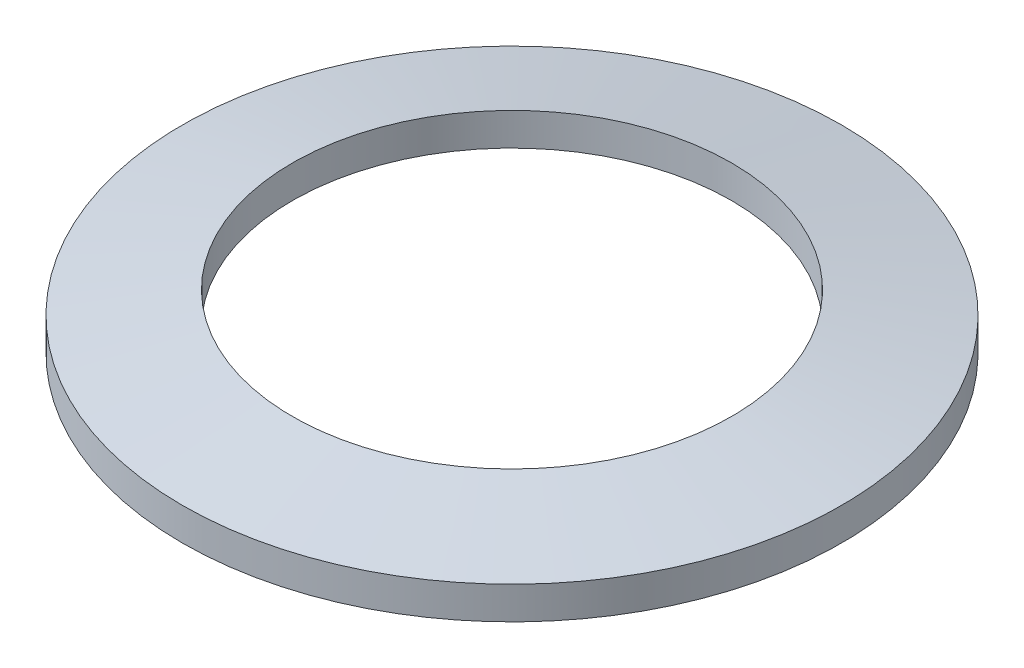
ISO-10303-21;
HEADER;
FILE_DESCRIPTION(('STEP AP214'),'2;1');
FILE_NAME('part.step','',(''),(''),'','','');
FILE_SCHEMA(('AUTOMOTIVE_DESIGN { 1 0 10303 214 1 1 1 1 }'));
ENDSEC;
DATA;
#1=APPLICATION_CONTEXT('core data for automotive mechanical design processes');
#2=APPLICATION_PROTOCOL_DEFINITION('international standard','automotive_design',2000,#1);
#3=PRODUCT_CONTEXT('',#1,'mechanical');
#4=PRODUCT('Part','Part','',(#3));
#5=PRODUCT_RELATED_PRODUCT_CATEGORY('part','',(#4));
#6=PRODUCT_DEFINITION_FORMATION('','',#4);
#7=PRODUCT_DEFINITION_CONTEXT('part definition',#1,'design');
#8=PRODUCT_DEFINITION('design','',#6,#7);
#9=PRODUCT_DEFINITION_SHAPE('','',#8);
#10=(LENGTH_UNIT() NAMED_UNIT(*) SI_UNIT(.MILLI.,.METRE.));
#11=(NAMED_UNIT(*) PLANE_ANGLE_UNIT() SI_UNIT($,.RADIAN.));
#12=(NAMED_UNIT(*) SI_UNIT($,.STERADIAN.) SOLID_ANGLE_UNIT());
#13=UNCERTAINTY_MEASURE_WITH_UNIT(LENGTH_MEASURE(1.E-05),#10,'distance_accuracy_value','');
#14=(GEOMETRIC_REPRESENTATION_CONTEXT(3) GLOBAL_UNCERTAINTY_ASSIGNED_CONTEXT((#13)) GLOBAL_UNIT_ASSIGNED_CONTEXT((#10,
#11,#12)) REPRESENTATION_CONTEXT('',''));
#15=CARTESIAN_POINT('',(0.,0.,0.));
#16=DIRECTION('',(0.,0.,1.));
#17=DIRECTION('',(1.,0.,0.));
#18=AXIS2_PLACEMENT_3D('',#15,#16,#17);
#19=CARTESIAN_POINT('',(0.,0.,0.));
#20=DIRECTION('',(0.,-1.,0.));
#21=DIRECTION('',(0.,0.,-1.));
#22=AXIS2_PLACEMENT_3D('',#19,#20,#21);
#23=CYLINDRICAL_SURFACE('',#22,14.9987);
#24=CARTESIAN_POINT('',(0.,0.,0.));
#25=DIRECTION('',(0.,-1.,0.));
#26=DIRECTION('',(0.,0.,-1.));
#27=AXIS2_PLACEMENT_3D('',#24,#25,#26);
#28=CIRCLE('',#27,14.9987);
#29=CARTESIAN_POINT('',(0.,0.,-14.9987));
#30=VERTEX_POINT('',#29);
#31=EDGE_CURVE('E10',#30,#30,#28,.T.);
#32=ORIENTED_EDGE('',*,*,#31,.F.);
#33=EDGE_LOOP('',(#32));
#34=FACE_BOUND('',#33,.T.);
#35=CARTESIAN_POINT('',(0.,1.48569506917667,0.));
#36=DIRECTION('',(0.,-1.,0.));
#37=DIRECTION('',(0.,0.,-1.));
#38=AXIS2_PLACEMENT_3D('',#35,#36,#37);
#39=CIRCLE('',#38,14.9987);
#40=CARTESIAN_POINT('',(0.,1.48569506917667,-14.9987));
#41=VERTEX_POINT('',#40);
#42=EDGE_CURVE('E44',#41,#41,#39,.T.);
#43=ORIENTED_EDGE('',*,*,#42,.T.);
#44=EDGE_LOOP('',(#43));
#45=FACE_BOUND('',#44,.T.);
#46=ADVANCED_FACE('F30',(#34,#45),#23,.T.);
#47=CARTESIAN_POINT('',(0.,0.,0.));
#48=DIRECTION('',(0.,-1.,0.));
#49=DIRECTION('',(0.,0.,-1.));
#50=AXIS2_PLACEMENT_3D('',#47,#48,#49);
#51=CONICAL_SURFACE('',#50,14.9987,1.37287335219841);
#52=CARTESIAN_POINT('',(0.,1.00350493082333,0.));
#53=DIRECTION('',(0.,-1.,0.));
#54=DIRECTION('',(0.,0.,-1.));
#55=AXIS2_PLACEMENT_3D('',#52,#53,#54);
#56=CIRCLE('',#55,9.9949);
#57=CARTESIAN_POINT('',(0.,1.00350493082333,-9.9949));
#58=VERTEX_POINT('',#57);
#59=EDGE_CURVE('E36',#58,#58,#56,.T.);
#60=ORIENTED_EDGE('',*,*,#59,.F.);
#61=EDGE_LOOP('',(#60));
#62=FACE_BOUND('',#61,.T.);
#63=ORIENTED_EDGE('',*,*,#31,.T.);
#64=EDGE_LOOP('',(#63));
#65=FACE_BOUND('',#64,.T.);
#66=ADVANCED_FACE('F59',(#62,#65),#51,.F.);
#67=CARTESIAN_POINT('',(0.,0.,0.));
#68=DIRECTION('',(0.,-1.,0.));
#69=DIRECTION('',(0.,0.,-1.));
#70=AXIS2_PLACEMENT_3D('',#67,#68,#69);
#71=CYLINDRICAL_SURFACE('',#70,9.9949);
#72=CARTESIAN_POINT('',(0.,2.4892,0.));
#73=DIRECTION('',(0.,-1.,0.));
#74=DIRECTION('',(0.,0.,-1.));
#75=AXIS2_PLACEMENT_3D('',#72,#73,#74);
#76=CIRCLE('',#75,9.9949);
#77=CARTESIAN_POINT('',(0.,2.4892,-9.9949));
#78=VERTEX_POINT('',#77);
#79=EDGE_CURVE('E40',#78,#78,#76,.T.);
#80=ORIENTED_EDGE('',*,*,#79,.F.);
#81=EDGE_LOOP('',(#80));
#82=FACE_BOUND('',#81,.T.);
#83=ORIENTED_EDGE('',*,*,#59,.T.);
#84=EDGE_LOOP('',(#83));
#85=FACE_BOUND('',#84,.T.);
#86=ADVANCED_FACE('F54',(#82,#85),#71,.F.);
#87=CARTESIAN_POINT('',(0.,2.4892,0.));
#88=DIRECTION('',(0.,-1.,0.));
#89=DIRECTION('',(0.,0.,-1.));
#90=AXIS2_PLACEMENT_3D('',#87,#88,#89);
#91=CONICAL_SURFACE('',#90,9.9949,1.37287335219841);
#92=ORIENTED_EDGE('',*,*,#42,.F.);
#93=EDGE_LOOP('',(#92));
#94=FACE_BOUND('',#93,.T.);
#95=ORIENTED_EDGE('',*,*,#79,.T.);
#96=EDGE_LOOP('',(#95));
#97=FACE_BOUND('',#96,.T.);
#98=ADVANCED_FACE('F51',(#94,#97),#91,.T.);
#99=CLOSED_SHELL('',(#46,#66,#86,#98));
#100=MANIFOLD_SOLID_BREP('B2',#99);
#101=ADVANCED_BREP_SHAPE_REPRESENTATION('',(#18,#100),#14);
#102=SHAPE_DEFINITION_REPRESENTATION(#9,#101);
ENDSEC;
END-ISO-10303-21;
